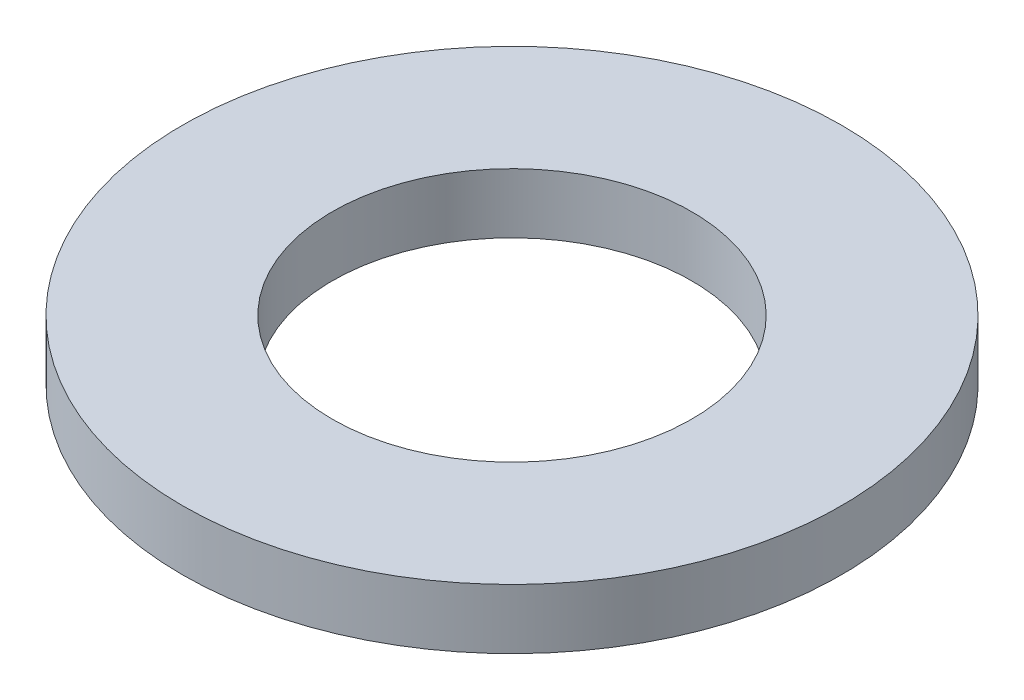
ISO-10303-21;
HEADER;
FILE_DESCRIPTION(('STEP AP214'),'2;1');
FILE_NAME('part.step','',(''),(''),'','','');
FILE_SCHEMA(('AUTOMOTIVE_DESIGN { 1 0 10303 214 1 1 1 1 }'));
ENDSEC;
DATA;
#1=APPLICATION_CONTEXT('core data for automotive mechanical design processes');
#2=APPLICATION_PROTOCOL_DEFINITION('international standard','automotive_design',2000,#1);
#3=PRODUCT_CONTEXT('',#1,'mechanical');
#4=PRODUCT('Part','Part','',(#3));
#5=PRODUCT_RELATED_PRODUCT_CATEGORY('part','',(#4));
#6=PRODUCT_DEFINITION_FORMATION('','',#4);
#7=PRODUCT_DEFINITION_CONTEXT('part definition',#1,'design');
#8=PRODUCT_DEFINITION('design','',#6,#7);
#9=PRODUCT_DEFINITION_SHAPE('','',#8);
#10=(LENGTH_UNIT() NAMED_UNIT(*) SI_UNIT(.MILLI.,.METRE.));
#11=(NAMED_UNIT(*) PLANE_ANGLE_UNIT() SI_UNIT($,.RADIAN.));
#12=(NAMED_UNIT(*) SI_UNIT($,.STERADIAN.) SOLID_ANGLE_UNIT());
#13=UNCERTAINTY_MEASURE_WITH_UNIT(LENGTH_MEASURE(1.E-05),#10,'distance_accuracy_value','');
#14=(GEOMETRIC_REPRESENTATION_CONTEXT(3) GLOBAL_UNCERTAINTY_ASSIGNED_CONTEXT((#13)) GLOBAL_UNIT_ASSIGNED_CONTEXT((#10,
#11,#12)) REPRESENTATION_CONTEXT('',''));
#15=CARTESIAN_POINT('',(0.,0.,0.));
#16=DIRECTION('',(0.,0.,1.));
#17=DIRECTION('',(1.,0.,0.));
#18=AXIS2_PLACEMENT_3D('',#15,#16,#17);
#19=CARTESIAN_POINT('',(0.,2.,0.));
#20=DIRECTION('',(0.,1.,0.));
#21=DIRECTION('',(0.,0.,1.));
#22=AXIS2_PLACEMENT_3D('',#19,#20,#21);
#23=PLANE('',#22);
#24=CARTESIAN_POINT('',(0.,2.,0.));
#25=DIRECTION('',(0.,1.,0.));
#26=DIRECTION('',(0.,0.,1.));
#27=AXIS2_PLACEMENT_3D('',#24,#25,#26);
#28=CIRCLE('',#27,11.);
#29=CARTESIAN_POINT('',(0.,2.,11.));
#30=VERTEX_POINT('',#29);
#31=EDGE_CURVE('E10',#30,#30,#28,.T.);
#32=ORIENTED_EDGE('',*,*,#31,.T.);
#33=EDGE_LOOP('',(#32));
#34=FACE_BOUND('',#33,.T.);
#35=CARTESIAN_POINT('',(0.,2.,0.));
#36=DIRECTION('',(0.,1.,0.));
#37=DIRECTION('',(0.,0.,1.));
#38=AXIS2_PLACEMENT_3D('',#35,#36,#37);
#39=CIRCLE('',#38,6.);
#40=CARTESIAN_POINT('',(0.,2.,6.));
#41=VERTEX_POINT('',#40);
#42=EDGE_CURVE('E48',#41,#41,#39,.T.);
#43=ORIENTED_EDGE('',*,*,#42,.F.);
#44=EDGE_LOOP('',(#43));
#45=FACE_BOUND('',#44,.T.);
#46=ADVANCED_FACE('F40',(#34,#45),#23,.T.);
#47=CARTESIAN_POINT('',(0.,0.,0.));
#48=DIRECTION('',(0.,1.,0.));
#49=DIRECTION('',(0.,0.,1.));
#50=AXIS2_PLACEMENT_3D('',#47,#48,#49);
#51=PLANE('',#50);
#52=CARTESIAN_POINT('',(0.,0.,0.));
#53=DIRECTION('',(0.,1.,0.));
#54=DIRECTION('',(0.,0.,1.));
#55=AXIS2_PLACEMENT_3D('',#52,#53,#54);
#56=CIRCLE('',#55,11.);
#57=CARTESIAN_POINT('',(0.,0.,11.));
#58=VERTEX_POINT('',#57);
#59=EDGE_CURVE('E41',#58,#58,#56,.T.);
#60=ORIENTED_EDGE('',*,*,#59,.F.);
#61=EDGE_LOOP('',(#60));
#62=FACE_BOUND('',#61,.T.);
#63=CARTESIAN_POINT('',(0.,0.,0.));
#64=DIRECTION('',(0.,1.,0.));
#65=DIRECTION('',(0.,0.,1.));
#66=AXIS2_PLACEMENT_3D('',#63,#64,#65);
#67=CIRCLE('',#66,6.);
#68=CARTESIAN_POINT('',(0.,0.,6.));
#69=VERTEX_POINT('',#68);
#70=EDGE_CURVE('E49',#69,#69,#67,.T.);
#71=ORIENTED_EDGE('',*,*,#70,.T.);
#72=EDGE_LOOP('',(#71));
#73=FACE_BOUND('',#72,.T.);
#74=ADVANCED_FACE('F58',(#62,#73),#51,.F.);
#75=CARTESIAN_POINT('',(0.,2.,0.));
#76=DIRECTION('',(0.,-1.,0.));
#77=DIRECTION('',(0.,0.,-1.));
#78=AXIS2_PLACEMENT_3D('',#75,#76,#77);
#79=CYLINDRICAL_SURFACE('',#78,11.);
#80=ORIENTED_EDGE('',*,*,#31,.F.);
#81=EDGE_LOOP('',(#80));
#82=FACE_BOUND('',#81,.T.);
#83=ORIENTED_EDGE('',*,*,#59,.T.);
#84=EDGE_LOOP('',(#83));
#85=FACE_BOUND('',#84,.T.);
#86=ADVANCED_FACE('F39',(#82,#85),#79,.T.);
#87=CARTESIAN_POINT('',(0.,2.,0.));
#88=DIRECTION('',(0.,-1.,0.));
#89=DIRECTION('',(0.,0.,-1.));
#90=AXIS2_PLACEMENT_3D('',#87,#88,#89);
#91=CYLINDRICAL_SURFACE('',#90,6.);
#92=ORIENTED_EDGE('',*,*,#42,.T.);
#93=EDGE_LOOP('',(#92));
#94=FACE_BOUND('',#93,.T.);
#95=ORIENTED_EDGE('',*,*,#70,.F.);
#96=EDGE_LOOP('',(#95));
#97=FACE_BOUND('',#96,.T.);
#98=ADVANCED_FACE('F57',(#94,#97),#91,.F.);
#99=CLOSED_SHELL('',(#46,#74,#86,#98));
#100=MANIFOLD_SOLID_BREP('B2',#99);
#101=ADVANCED_BREP_SHAPE_REPRESENTATION('',(#18,#100),#14);
#102=SHAPE_DEFINITION_REPRESENTATION(#9,#101);
ENDSEC;
END-ISO-10303-21;
